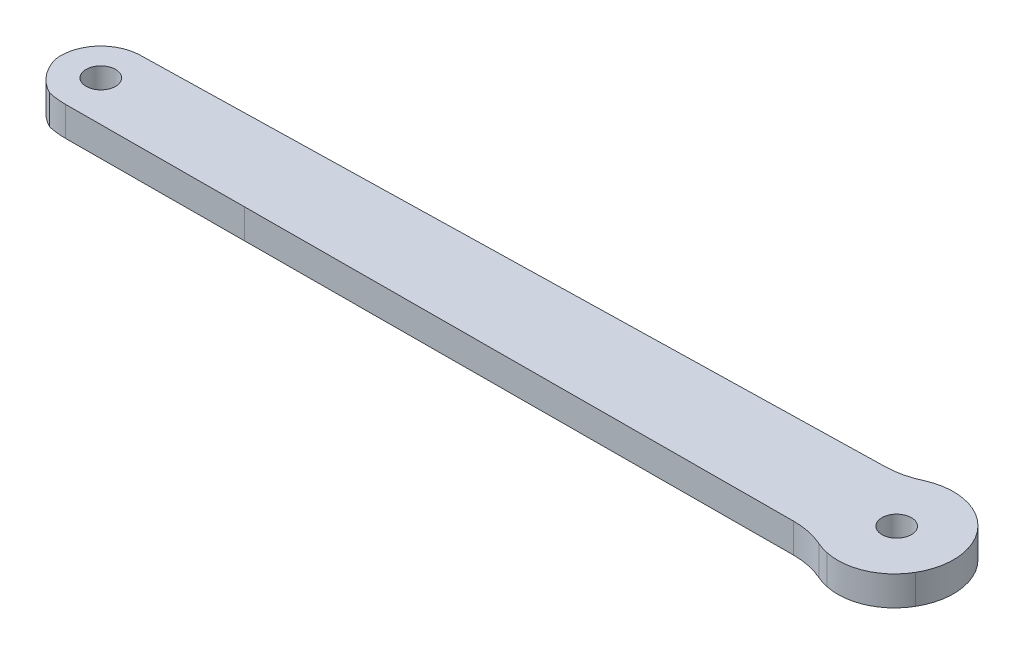
ISO-10303-21;
HEADER;
FILE_DESCRIPTION(('STEP AP214'),'2;1');
FILE_NAME('part.step','',(''),(''),'','','');
FILE_SCHEMA(('AUTOMOTIVE_DESIGN { 1 0 10303 214 1 1 1 1 }'));
ENDSEC;
DATA;
#1=APPLICATION_CONTEXT('core data for automotive mechanical design processes');
#2=APPLICATION_PROTOCOL_DEFINITION('international standard','automotive_design',2000,#1);
#3=PRODUCT_CONTEXT('',#1,'mechanical');
#4=PRODUCT('Part','Part','',(#3));
#5=PRODUCT_RELATED_PRODUCT_CATEGORY('part','',(#4));
#6=PRODUCT_DEFINITION_FORMATION('','',#4);
#7=PRODUCT_DEFINITION_CONTEXT('part definition',#1,'design');
#8=PRODUCT_DEFINITION('design','',#6,#7);
#9=PRODUCT_DEFINITION_SHAPE('','',#8);
#10=(LENGTH_UNIT() NAMED_UNIT(*) SI_UNIT(.MILLI.,.METRE.));
#11=(NAMED_UNIT(*) PLANE_ANGLE_UNIT() SI_UNIT($,.RADIAN.));
#12=(NAMED_UNIT(*) SI_UNIT($,.STERADIAN.) SOLID_ANGLE_UNIT());
#13=UNCERTAINTY_MEASURE_WITH_UNIT(LENGTH_MEASURE(1.E-05),#10,'distance_accuracy_value','');
#14=(GEOMETRIC_REPRESENTATION_CONTEXT(3) GLOBAL_UNCERTAINTY_ASSIGNED_CONTEXT((#13)) GLOBAL_UNIT_ASSIGNED_CONTEXT((#10,
#11,#12)) REPRESENTATION_CONTEXT('',''));
#15=CARTESIAN_POINT('',(0.,0.,0.));
#16=DIRECTION('',(0.,0.,1.));
#17=DIRECTION('',(1.,0.,0.));
#18=AXIS2_PLACEMENT_3D('',#15,#16,#17);
#19=CARTESIAN_POINT('',(83.786700155584,3.,-164.469026190633));
#20=DIRECTION('',(0.,1.,0.));
#21=DIRECTION('',(0.,0.,1.));
#22=AXIS2_PLACEMENT_3D('',#19,#20,#21);
#23=PLANE('',#22);
#24=CARTESIAN_POINT('',(9.77798402665884,3.,-150.824951800321));
#25=DIRECTION('',(0.,1.,0.));
#26=DIRECTION('',(0.,0.,1.));
#27=AXIS2_PLACEMENT_3D('',#24,#25,#26);
#28=CIRCLE('',#27,1.5);
#29=CARTESIAN_POINT('',(9.77798402665884,3.,-149.324951800321));
#30=VERTEX_POINT('',#29);
#31=EDGE_CURVE('E151',#30,#30,#28,.T.);
#32=ORIENTED_EDGE('',*,*,#31,.F.);
#33=EDGE_LOOP('',(#32));
#34=FACE_BOUND('',#33,.T.);
#35=CARTESIAN_POINT('',(83.786700155584,3.,-164.469026190633));
#36=DIRECTION('',(0.,-1.,0.));
#37=DIRECTION('',(0.,0.,1.));
#38=AXIS2_PLACEMENT_3D('',#35,#36,#37);
#39=CIRCLE('',#38,8.000403444878);
#40=CARTESIAN_POINT('',(87.2068985072511,3.,-157.236550921677));
#41=VERTEX_POINT('',#40);
#42=CARTESIAN_POINT('',(83.9642785340564,3.,-156.470593769195));
#43=VERTEX_POINT('',#42);
#44=EDGE_CURVE('E168',#41,#43,#39,.T.);
#45=ORIENTED_EDGE('',*,*,#44,.T.);
#46=DIRECTION('',(-0.999754351339683,0.,0.0221638664806159));
#47=VECTOR('',#46,1.);
#48=CARTESIAN_POINT('',(83.9642785340564,3.,-156.470593769195));
#49=LINE('',#48,#47);
#50=CARTESIAN_POINT('',(9.6893285591071,3.,-154.823969203977));
#51=VERTEX_POINT('',#50);
#52=EDGE_CURVE('E101',#43,#51,#49,.T.);
#53=ORIENTED_EDGE('',*,*,#52,.T.);
#54=CARTESIAN_POINT('',(9.85852986234284,3.,-150.747145406072));
#55=DIRECTION('',(0.,1.,0.));
#56=DIRECTION('',(0.,0.,1.));
#57=AXIS2_PLACEMENT_3D('',#54,#55,#56);
#58=CIRCLE('',#57,4.08033348639361);
#59=CARTESIAN_POINT('',(5.82514565190697,3.,-150.129947568105));
#60=VERTEX_POINT('',#59);
#61=EDGE_CURVE('E192',#51,#60,#58,.T.);
#62=ORIENTED_EDGE('',*,*,#61,.T.);
#63=CARTESIAN_POINT('',(10.8090030725798,3.,-151.532819219976));
#64=DIRECTION('',(0.,1.,0.));
#65=DIRECTION('',(0.,0.,1.));
#66=AXIS2_PLACEMENT_3D('',#63,#64,#65);
#67=CIRCLE('',#66,5.17753644711657);
#68=CARTESIAN_POINT('',(8.49347494000345,3.,-146.90192156094));
#69=VERTEX_POINT('',#68);
#70=EDGE_CURVE('E211',#60,#69,#67,.T.);
#71=ORIENTED_EDGE('',*,*,#70,.T.);
#72=CARTESIAN_POINT('',(10.3020977189816,3.,-154.69543650562));
#73=DIRECTION('',(0.,1.,0.));
#74=DIRECTION('',(0.,0.,1.));
#75=AXIS2_PLACEMENT_3D('',#72,#73,#74);
#76=CIRCLE('',#75,8.00062444747878);
#77=CARTESIAN_POINT('',(10.3363477725171,3.,-146.694885369391));
#78=VERTEX_POINT('',#77);
#79=EDGE_CURVE('E208',#69,#78,#76,.T.);
#80=ORIENTED_EDGE('',*,*,#79,.T.);
#81=DIRECTION('',(0.999990723069275,0.,-0.00430740935922579));
#82=VECTOR('',#81,1.);
#83=CARTESIAN_POINT('',(10.3363477725171,3.,-146.694885369391));
#84=LINE('',#83,#82);
#85=CARTESIAN_POINT('',(28.4307616397135,3.,-146.772826140083));
#86=VERTEX_POINT('',#85);
#87=EDGE_CURVE('E210',#78,#86,#84,.T.);
#88=ORIENTED_EDGE('',*,*,#87,.T.);
#89=DIRECTION('',(0.99999074479343,0.,-0.00430236301140789));
#90=VECTOR('',#89,1.);
#91=CARTESIAN_POINT('',(28.4307616397135,3.,-146.772826140083));
#92=LINE('',#91,#90);
#93=CARTESIAN_POINT('',(84.0810405641763,3.,-147.012256057675));
#94=VERTEX_POINT('',#93);
#95=EDGE_CURVE('E213',#86,#94,#92,.T.);
#96=ORIENTED_EDGE('',*,*,#95,.T.);
#97=CARTESIAN_POINT('',(84.1015346193669,3.,-139.013985829992));
#98=DIRECTION('',(0.,-1.,0.));
#99=DIRECTION('',(0.,0.,1.));
#100=AXIS2_PLACEMENT_3D('',#97,#98,#99);
#101=CIRCLE('',#100,7.99829648371107);
#102=CARTESIAN_POINT('',(87.3415370568645,3.,-146.326655031204));
#103=VERTEX_POINT('',#102);
#104=EDGE_CURVE('E129',#94,#103,#101,.T.);
#105=ORIENTED_EDGE('',*,*,#104,.T.);
#106=CARTESIAN_POINT('',(89.7719000262796,3.,-151.81242676414));
#107=DIRECTION('',(0.,1.,0.));
#108=DIRECTION('',(0.,0.,1.));
#109=AXIS2_PLACEMENT_3D('',#106,#107,#108);
#110=CIRCLE('',#109,6.00002963900896);
#111=CARTESIAN_POINT('',(88.5277803795432,3.,-145.942799691353));
#112=VERTEX_POINT('',#111);
#113=EDGE_CURVE('E123',#103,#112,#110,.T.);
#114=ORIENTED_EDGE('',*,*,#113,.T.);
#115=CARTESIAN_POINT('',(89.7925074492697,3.,-151.571921340207));
#116=DIRECTION('',(0.,1.,0.));
#117=DIRECTION('',(0.,0.,1.));
#118=AXIS2_PLACEMENT_3D('',#115,#116,#117);
#119=CIRCLE('',#118,5.76944928901289);
#120=CARTESIAN_POINT('',(94.7987935013487,3.,-148.704231492394));
#121=VERTEX_POINT('',#120);
#122=EDGE_CURVE('E127',#112,#121,#119,.T.);
#123=ORIENTED_EDGE('',*,*,#122,.T.);
#124=CARTESIAN_POINT('',(89.626537508927,3.,-151.745778173855));
#125=DIRECTION('',(0.,1.,0.));
#126=DIRECTION('',(0.,0.,1.));
#127=AXIS2_PLACEMENT_3D('',#124,#125,#126);
#128=CIRCLE('',#127,6.00026984948597);
#129=EDGE_CURVE('E49',#121,#41,#128,.T.);
#130=ORIENTED_EDGE('',*,*,#129,.T.);
#131=EDGE_LOOP('',(#45,#53,#62,#71,#80,#88,#96,#105,#114,#123,#130));
#132=FACE_BOUND('',#131,.T.);
#133=CARTESIAN_POINT('',(89.7718472401299,3.,-151.812467685397));
#134=DIRECTION('',(0.,1.,0.));
#135=DIRECTION('',(0.,0.,1.));
#136=AXIS2_PLACEMENT_3D('',#133,#134,#135);
#137=CIRCLE('',#136,1.5);
#138=CARTESIAN_POINT('',(89.7718472401299,3.,-150.312467685397));
#139=VERTEX_POINT('',#138);
#140=EDGE_CURVE('E258',#139,#139,#137,.T.);
#141=ORIENTED_EDGE('',*,*,#140,.F.);
#142=EDGE_LOOP('',(#141));
#143=FACE_BOUND('',#142,.T.);
#144=ADVANCED_FACE('F32',(#34,#132,#143),#23,.T.);
#145=CARTESIAN_POINT('',(83.786700155584,0.,-164.469026190633));
#146=DIRECTION('',(0.,1.,0.));
#147=DIRECTION('',(0.,0.,1.));
#148=AXIS2_PLACEMENT_3D('',#145,#146,#147);
#149=PLANE('',#148);
#150=CARTESIAN_POINT('',(83.786700155584,0.,-164.469026190633));
#151=DIRECTION('',(0.,-1.,0.));
#152=DIRECTION('',(0.,0.,1.));
#153=AXIS2_PLACEMENT_3D('',#150,#151,#152);
#154=CIRCLE('',#153,8.000403444878);
#155=CARTESIAN_POINT('',(87.2068985072511,0.,-157.236550921677));
#156=VERTEX_POINT('',#155);
#157=CARTESIAN_POINT('',(83.9642785340564,0.,-156.470593769195));
#158=VERTEX_POINT('',#157);
#159=EDGE_CURVE('E147',#156,#158,#154,.T.);
#160=ORIENTED_EDGE('',*,*,#159,.F.);
#161=CARTESIAN_POINT('',(89.626537508927,0.,-151.745778173855));
#162=DIRECTION('',(0.,1.,0.));
#163=DIRECTION('',(0.,0.,1.));
#164=AXIS2_PLACEMENT_3D('',#161,#162,#163);
#165=CIRCLE('',#164,6.00026984948597);
#166=CARTESIAN_POINT('',(94.7987935013487,0.,-148.704231492394));
#167=VERTEX_POINT('',#166);
#168=EDGE_CURVE('E93',#167,#156,#165,.T.);
#169=ORIENTED_EDGE('',*,*,#168,.F.);
#170=CARTESIAN_POINT('',(89.7925074492697,0.,-151.571921340207));
#171=DIRECTION('',(0.,1.,0.));
#172=DIRECTION('',(0.,0.,1.));
#173=AXIS2_PLACEMENT_3D('',#170,#171,#172);
#174=CIRCLE('',#173,5.76944928901289);
#175=CARTESIAN_POINT('',(88.5277803795432,0.,-145.942799691353));
#176=VERTEX_POINT('',#175);
#177=EDGE_CURVE('E87',#176,#167,#174,.T.);
#178=ORIENTED_EDGE('',*,*,#177,.F.);
#179=CARTESIAN_POINT('',(89.7719000262796,0.,-151.81242676414));
#180=DIRECTION('',(0.,1.,0.));
#181=DIRECTION('',(0.,0.,1.));
#182=AXIS2_PLACEMENT_3D('',#179,#180,#181);
#183=CIRCLE('',#182,6.00002963900896);
#184=CARTESIAN_POINT('',(87.3415370568645,0.,-146.326655031204));
#185=VERTEX_POINT('',#184);
#186=EDGE_CURVE('E137',#185,#176,#183,.T.);
#187=ORIENTED_EDGE('',*,*,#186,.F.);
#188=CARTESIAN_POINT('',(84.1015346193669,0.,-139.013985829992));
#189=DIRECTION('',(0.,-1.,0.));
#190=DIRECTION('',(0.,0.,1.));
#191=AXIS2_PLACEMENT_3D('',#188,#189,#190);
#192=CIRCLE('',#191,7.99829648371107);
#193=CARTESIAN_POINT('',(84.0810405641763,0.,-147.012256057675));
#194=VERTEX_POINT('',#193);
#195=EDGE_CURVE('E163',#194,#185,#192,.T.);
#196=ORIENTED_EDGE('',*,*,#195,.F.);
#197=DIRECTION('',(0.99999074479343,0.,-0.00430236301140789));
#198=VECTOR('',#197,1.);
#199=CARTESIAN_POINT('',(28.4307616397135,0.,-146.772826140083));
#200=LINE('',#199,#198);
#201=CARTESIAN_POINT('',(28.4307616397135,0.,-146.772826140083));
#202=VERTEX_POINT('',#201);
#203=EDGE_CURVE('E161',#202,#194,#200,.T.);
#204=ORIENTED_EDGE('',*,*,#203,.F.);
#205=DIRECTION('',(0.999990723069275,0.,-0.00430740935922579));
#206=VECTOR('',#205,1.);
#207=CARTESIAN_POINT('',(10.3363477725171,0.,-146.694885369391));
#208=LINE('',#207,#206);
#209=CARTESIAN_POINT('',(10.3363477725171,0.,-146.694885369391));
#210=VERTEX_POINT('',#209);
#211=EDGE_CURVE('E159',#210,#202,#208,.T.);
#212=ORIENTED_EDGE('',*,*,#211,.F.);
#213=CARTESIAN_POINT('',(10.3020977189816,0.,-154.69543650562));
#214=DIRECTION('',(0.,1.,0.));
#215=DIRECTION('',(0.,0.,1.));
#216=AXIS2_PLACEMENT_3D('',#213,#214,#215);
#217=CIRCLE('',#216,8.00062444747878);
#218=CARTESIAN_POINT('',(8.49347494000345,0.,-146.90192156094));
#219=VERTEX_POINT('',#218);
#220=EDGE_CURVE('E157',#219,#210,#217,.T.);
#221=ORIENTED_EDGE('',*,*,#220,.F.);
#222=CARTESIAN_POINT('',(10.8090030725798,0.,-151.532819219976));
#223=DIRECTION('',(0.,1.,0.));
#224=DIRECTION('',(0.,0.,1.));
#225=AXIS2_PLACEMENT_3D('',#222,#223,#224);
#226=CIRCLE('',#225,5.17753644711657);
#227=CARTESIAN_POINT('',(5.82514565190697,0.,-150.129947568105));
#228=VERTEX_POINT('',#227);
#229=EDGE_CURVE('E155',#228,#219,#226,.T.);
#230=ORIENTED_EDGE('',*,*,#229,.F.);
#231=CARTESIAN_POINT('',(9.85852986234284,0.,-150.747145406072));
#232=DIRECTION('',(0.,1.,0.));
#233=DIRECTION('',(0.,0.,1.));
#234=AXIS2_PLACEMENT_3D('',#231,#232,#233);
#235=CIRCLE('',#234,4.08033348639361);
#236=CARTESIAN_POINT('',(9.6893285591071,0.,-154.823969203977));
#237=VERTEX_POINT('',#236);
#238=EDGE_CURVE('E153',#237,#228,#235,.T.);
#239=ORIENTED_EDGE('',*,*,#238,.F.);
#240=DIRECTION('',(-0.999754351339683,0.,0.0221638664806159));
#241=VECTOR('',#240,1.);
#242=CARTESIAN_POINT('',(83.9642785340564,0.,-156.470593769195));
#243=LINE('',#242,#241);
#244=EDGE_CURVE('E150',#158,#237,#243,.T.);
#245=ORIENTED_EDGE('',*,*,#244,.F.);
#246=EDGE_LOOP('',(#160,#169,#178,#187,#196,#204,#212,#221,#230,#239,#245));
#247=FACE_BOUND('',#246,.T.);
#248=CARTESIAN_POINT('',(9.77798402665884,0.,-150.824951800321));
#249=DIRECTION('',(0.,1.,0.));
#250=DIRECTION('',(0.,0.,1.));
#251=AXIS2_PLACEMENT_3D('',#248,#249,#250);
#252=CIRCLE('',#251,1.5);
#253=CARTESIAN_POINT('',(9.77798402665884,0.,-149.324951800321));
#254=VERTEX_POINT('',#253);
#255=EDGE_CURVE('E264',#254,#254,#252,.T.);
#256=ORIENTED_EDGE('',*,*,#255,.T.);
#257=EDGE_LOOP('',(#256));
#258=FACE_BOUND('',#257,.T.);
#259=CARTESIAN_POINT('',(89.7718472401299,0.,-151.812467685397));
#260=DIRECTION('',(0.,1.,0.));
#261=DIRECTION('',(0.,0.,1.));
#262=AXIS2_PLACEMENT_3D('',#259,#260,#261);
#263=CIRCLE('',#262,1.5);
#264=CARTESIAN_POINT('',(89.7718472401299,0.,-150.312467685397));
#265=VERTEX_POINT('',#264);
#266=EDGE_CURVE('E261',#265,#265,#263,.T.);
#267=ORIENTED_EDGE('',*,*,#266,.T.);
#268=EDGE_LOOP('',(#267));
#269=FACE_BOUND('',#268,.T.);
#270=ADVANCED_FACE('F196',(#247,#258,#269),#149,.F.);
#271=CARTESIAN_POINT('',(83.786700155584,3.,-164.469026190633));
#272=DIRECTION('',(0.,-1.,0.));
#273=DIRECTION('',(0.,0.,-1.));
#274=AXIS2_PLACEMENT_3D('',#271,#272,#273);
#275=CYLINDRICAL_SURFACE('',#274,8.000403444878);
#276=ORIENTED_EDGE('',*,*,#159,.T.);
#277=DIRECTION('',(0.,-1.,0.));
#278=VECTOR('',#277,1.);
#279=CARTESIAN_POINT('',(83.9642785340564,3.,-156.470593769195));
#280=LINE('',#279,#278);
#281=EDGE_CURVE('E11',#43,#158,#280,.T.);
#282=ORIENTED_EDGE('',*,*,#281,.F.);
#283=ORIENTED_EDGE('',*,*,#44,.F.);
#284=DIRECTION('',(0.,-1.,0.));
#285=VECTOR('',#284,1.);
#286=CARTESIAN_POINT('',(87.2068985072511,3.,-157.236550921677));
#287=LINE('',#286,#285);
#288=EDGE_CURVE('E143',#41,#156,#287,.T.);
#289=ORIENTED_EDGE('',*,*,#288,.T.);
#290=EDGE_LOOP('',(#276,#282,#283,#289));
#291=FACE_BOUND('',#290,.T.);
#292=ADVANCED_FACE('F34',(#291),#275,.F.);
#293=CARTESIAN_POINT('',(83.9642785340564,3.,-156.470593769195));
#294=DIRECTION('',(0.0221638664806159,0.,0.999754351339682));
#295=DIRECTION('',(0.999754351339683,0.,-0.0221638664806159));
#296=AXIS2_PLACEMENT_3D('',#293,#294,#295);
#297=PLANE('',#296);
#298=ORIENTED_EDGE('',*,*,#244,.T.);
#299=DIRECTION('',(0.,-1.,0.));
#300=VECTOR('',#299,1.);
#301=CARTESIAN_POINT('',(9.6893285591071,3.,-154.823969203977));
#302=LINE('',#301,#300);
#303=EDGE_CURVE('E41',#51,#237,#302,.T.);
#304=ORIENTED_EDGE('',*,*,#303,.F.);
#305=ORIENTED_EDGE('',*,*,#52,.F.);
#306=ORIENTED_EDGE('',*,*,#281,.T.);
#307=EDGE_LOOP('',(#298,#304,#305,#306));
#308=FACE_BOUND('',#307,.T.);
#309=ADVANCED_FACE('F347',(#308),#297,.F.);
#310=CARTESIAN_POINT('',(9.85852986234284,3.,-150.747145406072));
#311=DIRECTION('',(0.,-1.,0.));
#312=DIRECTION('',(0.,0.,-1.));
#313=AXIS2_PLACEMENT_3D('',#310,#311,#312);
#314=CYLINDRICAL_SURFACE('',#313,4.08033348639361);
#315=ORIENTED_EDGE('',*,*,#238,.T.);
#316=DIRECTION('',(0.,-1.,0.));
#317=VECTOR('',#316,1.);
#318=CARTESIAN_POINT('',(5.82514565190697,3.,-150.129947568105));
#319=LINE('',#318,#317);
#320=EDGE_CURVE('E184',#60,#228,#319,.T.);
#321=ORIENTED_EDGE('',*,*,#320,.F.);
#322=ORIENTED_EDGE('',*,*,#61,.F.);
#323=ORIENTED_EDGE('',*,*,#303,.T.);
#324=EDGE_LOOP('',(#315,#321,#322,#323));
#325=FACE_BOUND('',#324,.T.);
#326=ADVANCED_FACE('F190',(#325),#314,.T.);
#327=CARTESIAN_POINT('',(10.8090030725798,3.,-151.532819219976));
#328=DIRECTION('',(0.,-1.,0.));
#329=DIRECTION('',(0.,0.,-1.));
#330=AXIS2_PLACEMENT_3D('',#327,#328,#329);
#331=CYLINDRICAL_SURFACE('',#330,5.17753644711657);
#332=ORIENTED_EDGE('',*,*,#229,.T.);
#333=DIRECTION('',(0.,-1.,0.));
#334=VECTOR('',#333,1.);
#335=CARTESIAN_POINT('',(8.49347494000345,3.,-146.90192156094));
#336=LINE('',#335,#334);
#337=EDGE_CURVE('E181',#69,#219,#336,.T.);
#338=ORIENTED_EDGE('',*,*,#337,.F.);
#339=ORIENTED_EDGE('',*,*,#70,.F.);
#340=ORIENTED_EDGE('',*,*,#320,.T.);
#341=EDGE_LOOP('',(#332,#338,#339,#340));
#342=FACE_BOUND('',#341,.T.);
#343=ADVANCED_FACE('F202',(#342),#331,.T.);
#344=CARTESIAN_POINT('',(10.3020977189816,3.,-154.69543650562));
#345=DIRECTION('',(0.,-1.,0.));
#346=DIRECTION('',(0.,0.,-1.));
#347=AXIS2_PLACEMENT_3D('',#344,#345,#346);
#348=CYLINDRICAL_SURFACE('',#347,8.00062444747878);
#349=ORIENTED_EDGE('',*,*,#220,.T.);
#350=DIRECTION('',(0.,-1.,0.));
#351=VECTOR('',#350,1.);
#352=CARTESIAN_POINT('',(10.3363477725171,3.,-146.694885369391));
#353=LINE('',#352,#351);
#354=EDGE_CURVE('E178',#78,#210,#353,.T.);
#355=ORIENTED_EDGE('',*,*,#354,.F.);
#356=ORIENTED_EDGE('',*,*,#79,.F.);
#357=ORIENTED_EDGE('',*,*,#337,.T.);
#358=EDGE_LOOP('',(#349,#355,#356,#357));
#359=FACE_BOUND('',#358,.T.);
#360=ADVANCED_FACE('F206',(#359),#348,.T.);
#361=CARTESIAN_POINT('',(10.3363477725171,3.,-146.694885369391));
#362=DIRECTION('',(-0.00430740935922579,0.,-0.999990723069275));
#363=DIRECTION('',(-0.999990723069275,0.,0.00430740935922579));
#364=AXIS2_PLACEMENT_3D('',#361,#362,#363);
#365=PLANE('',#364);
#366=ORIENTED_EDGE('',*,*,#211,.T.);
#367=DIRECTION('',(0.,-1.,0.));
#368=VECTOR('',#367,1.);
#369=CARTESIAN_POINT('',(28.4307616397135,3.,-146.772826140083));
#370=LINE('',#369,#368);
#371=EDGE_CURVE('E175',#86,#202,#370,.T.);
#372=ORIENTED_EDGE('',*,*,#371,.F.);
#373=ORIENTED_EDGE('',*,*,#87,.F.);
#374=ORIENTED_EDGE('',*,*,#354,.T.);
#375=EDGE_LOOP('',(#366,#372,#373,#374));
#376=FACE_BOUND('',#375,.T.);
#377=ADVANCED_FACE('F313',(#376),#365,.F.);
#378=CARTESIAN_POINT('',(28.4307616397135,3.,-146.772826140083));
#379=DIRECTION('',(-0.00430236301140789,0.,-0.999990744793429));
#380=DIRECTION('',(-0.99999074479343,0.,0.00430236301140789));
#381=AXIS2_PLACEMENT_3D('',#378,#379,#380);
#382=PLANE('',#381);
#383=ORIENTED_EDGE('',*,*,#203,.T.);
#384=DIRECTION('',(0.,-1.,0.));
#385=VECTOR('',#384,1.);
#386=CARTESIAN_POINT('',(84.0810405641763,3.,-147.012256057675));
#387=LINE('',#386,#385);
#388=EDGE_CURVE('E172',#94,#194,#387,.T.);
#389=ORIENTED_EDGE('',*,*,#388,.F.);
#390=ORIENTED_EDGE('',*,*,#95,.F.);
#391=ORIENTED_EDGE('',*,*,#371,.T.);
#392=EDGE_LOOP('',(#383,#389,#390,#391));
#393=FACE_BOUND('',#392,.T.);
#394=ADVANCED_FACE('F222',(#393),#382,.F.);
#395=CARTESIAN_POINT('',(84.1015346193669,3.,-139.013985829992));
#396=DIRECTION('',(0.,-1.,0.));
#397=DIRECTION('',(0.,0.,-1.));
#398=AXIS2_PLACEMENT_3D('',#395,#396,#397);
#399=CYLINDRICAL_SURFACE('',#398,7.99829648371107);
#400=ORIENTED_EDGE('',*,*,#195,.T.);
#401=DIRECTION('',(0.,-1.,0.));
#402=VECTOR('',#401,1.);
#403=CARTESIAN_POINT('',(87.3415370568645,3.,-146.326655031204));
#404=LINE('',#403,#402);
#405=EDGE_CURVE('E138',#103,#185,#404,.T.);
#406=ORIENTED_EDGE('',*,*,#405,.F.);
#407=ORIENTED_EDGE('',*,*,#104,.F.);
#408=ORIENTED_EDGE('',*,*,#388,.T.);
#409=EDGE_LOOP('',(#400,#406,#407,#408));
#410=FACE_BOUND('',#409,.T.);
#411=ADVANCED_FACE('F226',(#410),#399,.F.);
#412=CARTESIAN_POINT('',(89.7719000262796,3.,-151.81242676414));
#413=DIRECTION('',(0.,-1.,0.));
#414=DIRECTION('',(0.,0.,-1.));
#415=AXIS2_PLACEMENT_3D('',#412,#413,#414);
#416=CYLINDRICAL_SURFACE('',#415,6.00002963900896);
#417=ORIENTED_EDGE('',*,*,#186,.T.);
#418=DIRECTION('',(0.,-1.,0.));
#419=VECTOR('',#418,1.);
#420=CARTESIAN_POINT('',(88.5277803795432,3.,-145.942799691353));
#421=LINE('',#420,#419);
#422=EDGE_CURVE('E134',#112,#176,#421,.T.);
#423=ORIENTED_EDGE('',*,*,#422,.F.);
#424=ORIENTED_EDGE('',*,*,#113,.F.);
#425=ORIENTED_EDGE('',*,*,#405,.T.);
#426=EDGE_LOOP('',(#417,#423,#424,#425));
#427=FACE_BOUND('',#426,.T.);
#428=ADVANCED_FACE('F135',(#427),#416,.T.);
#429=CARTESIAN_POINT('',(89.7925074492697,3.,-151.571921340207));
#430=DIRECTION('',(0.,-1.,0.));
#431=DIRECTION('',(0.,0.,-1.));
#432=AXIS2_PLACEMENT_3D('',#429,#430,#431);
#433=CYLINDRICAL_SURFACE('',#432,5.76944928901289);
#434=ORIENTED_EDGE('',*,*,#177,.T.);
#435=DIRECTION('',(0.,-1.,0.));
#436=VECTOR('',#435,1.);
#437=CARTESIAN_POINT('',(94.7987935013487,3.,-148.704231492394));
#438=LINE('',#437,#436);
#439=EDGE_CURVE('E139',#121,#167,#438,.T.);
#440=ORIENTED_EDGE('',*,*,#439,.F.);
#441=ORIENTED_EDGE('',*,*,#122,.F.);
#442=ORIENTED_EDGE('',*,*,#422,.T.);
#443=EDGE_LOOP('',(#434,#440,#441,#442));
#444=FACE_BOUND('',#443,.T.);
#445=ADVANCED_FACE('F141',(#444),#433,.T.);
#446=CARTESIAN_POINT('',(89.626537508927,3.,-151.745778173855));
#447=DIRECTION('',(0.,-1.,0.));
#448=DIRECTION('',(0.,0.,-1.));
#449=AXIS2_PLACEMENT_3D('',#446,#447,#448);
#450=CYLINDRICAL_SURFACE('',#449,6.00026984948597);
#451=ORIENTED_EDGE('',*,*,#168,.T.);
#452=ORIENTED_EDGE('',*,*,#288,.F.);
#453=ORIENTED_EDGE('',*,*,#129,.F.);
#454=ORIENTED_EDGE('',*,*,#439,.T.);
#455=EDGE_LOOP('',(#451,#452,#453,#454));
#456=FACE_BOUND('',#455,.T.);
#457=ADVANCED_FACE('F230',(#456),#450,.T.);
#458=CARTESIAN_POINT('',(9.77798402665884,3.,-150.824951800321));
#459=DIRECTION('',(0.,-1.,0.));
#460=DIRECTION('',(0.,0.,-1.));
#461=AXIS2_PLACEMENT_3D('',#458,#459,#460);
#462=CYLINDRICAL_SURFACE('',#461,1.5);
#463=ORIENTED_EDGE('',*,*,#31,.T.);
#464=EDGE_LOOP('',(#463));
#465=FACE_BOUND('',#464,.T.);
#466=ORIENTED_EDGE('',*,*,#255,.F.);
#467=EDGE_LOOP('',(#466));
#468=FACE_BOUND('',#467,.T.);
#469=ADVANCED_FACE('F232',(#465,#468),#462,.F.);
#470=CARTESIAN_POINT('',(89.7718472401299,3.,-151.812467685397));
#471=DIRECTION('',(0.,-1.,0.));
#472=DIRECTION('',(0.,0.,-1.));
#473=AXIS2_PLACEMENT_3D('',#470,#471,#472);
#474=CYLINDRICAL_SURFACE('',#473,1.5);
#475=ORIENTED_EDGE('',*,*,#140,.T.);
#476=EDGE_LOOP('',(#475));
#477=FACE_BOUND('',#476,.T.);
#478=ORIENTED_EDGE('',*,*,#266,.F.);
#479=EDGE_LOOP('',(#478));
#480=FACE_BOUND('',#479,.T.);
#481=ADVANCED_FACE('F238',(#477,#480),#474,.F.);
#482=CLOSED_SHELL('',(#144,#270,#292,#309,#326,#343,#360,#377,#394,#411,#428,#445,#457,#469,#481));
#483=MANIFOLD_SOLID_BREP('B2',#482);
#484=ADVANCED_BREP_SHAPE_REPRESENTATION('',(#18,#483),#14);
#485=SHAPE_DEFINITION_REPRESENTATION(#9,#484);
ENDSEC;
END-ISO-10303-21;
